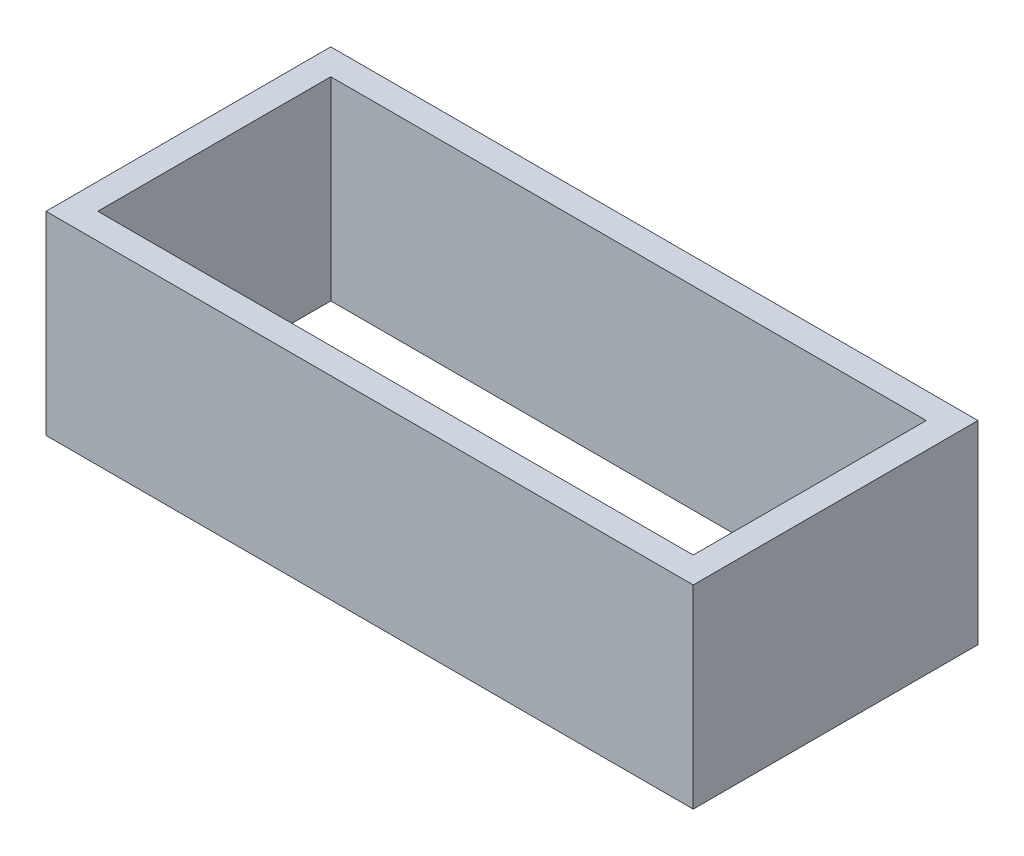
ISO-10303-21;
HEADER;
FILE_DESCRIPTION(('STEP AP214'),'2;1');
FILE_NAME('part.step','',(''),(''),'','','');
FILE_SCHEMA(('AUTOMOTIVE_DESIGN { 1 0 10303 214 1 1 1 1 }'));
ENDSEC;
DATA;
#1=APPLICATION_CONTEXT('core data for automotive mechanical design processes');
#2=APPLICATION_PROTOCOL_DEFINITION('international standard','automotive_design',2000,#1);
#3=PRODUCT_CONTEXT('',#1,'mechanical');
#4=PRODUCT('Part','Part','',(#3));
#5=PRODUCT_RELATED_PRODUCT_CATEGORY('part','',(#4));
#6=PRODUCT_DEFINITION_FORMATION('','',#4);
#7=PRODUCT_DEFINITION_CONTEXT('part definition',#1,'design');
#8=PRODUCT_DEFINITION('design','',#6,#7);
#9=PRODUCT_DEFINITION_SHAPE('','',#8);
#10=(LENGTH_UNIT() NAMED_UNIT(*) SI_UNIT(.MILLI.,.METRE.));
#11=(NAMED_UNIT(*) PLANE_ANGLE_UNIT() SI_UNIT($,.RADIAN.));
#12=(NAMED_UNIT(*) SI_UNIT($,.STERADIAN.) SOLID_ANGLE_UNIT());
#13=UNCERTAINTY_MEASURE_WITH_UNIT(LENGTH_MEASURE(1.E-05),#10,'distance_accuracy_value','');
#14=(GEOMETRIC_REPRESENTATION_CONTEXT(3) GLOBAL_UNCERTAINTY_ASSIGNED_CONTEXT((#13)) GLOBAL_UNIT_ASSIGNED_CONTEXT((#10,
#11,#12)) REPRESENTATION_CONTEXT('',''));
#15=CARTESIAN_POINT('',(0.,0.,0.));
#16=DIRECTION('',(0.,0.,1.));
#17=DIRECTION('',(1.,0.,0.));
#18=AXIS2_PLACEMENT_3D('',#15,#16,#17);
#19=CARTESIAN_POINT('',(0.,30.,0.));
#20=DIRECTION('',(0.,-1.,0.));
#21=DIRECTION('',(0.,0.,-1.));
#22=AXIS2_PLACEMENT_3D('',#19,#20,#21);
#23=PLANE('',#22);
#24=DIRECTION('',(0.,0.,-1.));
#25=VECTOR('',#24,1.);
#26=CARTESIAN_POINT('',(50.,30.,22.));
#27=LINE('',#26,#25);
#28=CARTESIAN_POINT('',(50.,30.,22.));
#29=VERTEX_POINT('',#28);
#30=CARTESIAN_POINT('',(50.,30.,-22.));
#31=VERTEX_POINT('',#30);
#32=EDGE_CURVE('E142',#29,#31,#27,.T.);
#33=ORIENTED_EDGE('',*,*,#32,.T.);
#34=DIRECTION('',(-1.,0.,0.));
#35=VECTOR('',#34,1.);
#36=CARTESIAN_POINT('',(-50.,30.,-22.));
#37=LINE('',#36,#35);
#38=CARTESIAN_POINT('',(-50.,30.,-22.));
#39=VERTEX_POINT('',#38);
#40=EDGE_CURVE('E145',#31,#39,#37,.T.);
#41=ORIENTED_EDGE('',*,*,#40,.T.);
#42=DIRECTION('',(0.,0.,1.));
#43=VECTOR('',#42,1.);
#44=CARTESIAN_POINT('',(-50.,30.,22.));
#45=LINE('',#44,#43);
#46=CARTESIAN_POINT('',(-50.,30.,22.));
#47=VERTEX_POINT('',#46);
#48=EDGE_CURVE('E148',#39,#47,#45,.T.);
#49=ORIENTED_EDGE('',*,*,#48,.T.);
#50=DIRECTION('',(1.,0.,0.));
#51=VECTOR('',#50,1.);
#52=CARTESIAN_POINT('',(-50.,30.,22.));
#53=LINE('',#52,#51);
#54=EDGE_CURVE('E150',#47,#29,#53,.T.);
#55=ORIENTED_EDGE('',*,*,#54,.T.);
#56=EDGE_LOOP('',(#33,#41,#49,#55));
#57=FACE_BOUND('',#56,.T.);
#58=DIRECTION('',(0.,0.,-1.));
#59=VECTOR('',#58,1.);
#60=CARTESIAN_POINT('',(46.,30.,-18.));
#61=LINE('',#60,#59);
#62=CARTESIAN_POINT('',(46.,30.,18.));
#63=VERTEX_POINT('',#62);
#64=CARTESIAN_POINT('',(46.,30.,-18.));
#65=VERTEX_POINT('',#64);
#66=EDGE_CURVE('E106',#63,#65,#61,.T.);
#67=ORIENTED_EDGE('',*,*,#66,.F.);
#68=DIRECTION('',(1.,0.,0.));
#69=VECTOR('',#68,1.);
#70=CARTESIAN_POINT('',(-46.,30.,18.));
#71=LINE('',#70,#69);
#72=CARTESIAN_POINT('',(-46.,30.,18.));
#73=VERTEX_POINT('',#72);
#74=EDGE_CURVE('E128',#73,#63,#71,.T.);
#75=ORIENTED_EDGE('',*,*,#74,.F.);
#76=DIRECTION('',(0.,0.,1.));
#77=VECTOR('',#76,1.);
#78=CARTESIAN_POINT('',(-46.,30.,-18.));
#79=LINE('',#78,#77);
#80=CARTESIAN_POINT('',(-46.,30.,-18.));
#81=VERTEX_POINT('',#80);
#82=EDGE_CURVE('E126',#81,#73,#79,.T.);
#83=ORIENTED_EDGE('',*,*,#82,.F.);
#84=DIRECTION('',(-1.,0.,0.));
#85=VECTOR('',#84,1.);
#86=CARTESIAN_POINT('',(-46.,30.,-18.));
#87=LINE('',#86,#85);
#88=EDGE_CURVE('E114',#65,#81,#87,.T.);
#89=ORIENTED_EDGE('',*,*,#88,.F.);
#90=EDGE_LOOP('',(#67,#75,#83,#89));
#91=FACE_BOUND('',#90,.T.);
#92=ADVANCED_FACE('F41',(#57,#91),#23,.F.);
#93=CARTESIAN_POINT('',(0.,0.,0.));
#94=DIRECTION('',(0.,-1.,0.));
#95=DIRECTION('',(0.,0.,-1.));
#96=AXIS2_PLACEMENT_3D('',#93,#94,#95);
#97=PLANE('',#96);
#98=DIRECTION('',(0.,0.,-1.));
#99=VECTOR('',#98,1.);
#100=CARTESIAN_POINT('',(50.,0.,22.));
#101=LINE('',#100,#99);
#102=CARTESIAN_POINT('',(50.,0.,22.));
#103=VERTEX_POINT('',#102);
#104=CARTESIAN_POINT('',(50.,0.,-22.));
#105=VERTEX_POINT('',#104);
#106=EDGE_CURVE('E122',#103,#105,#101,.T.);
#107=ORIENTED_EDGE('',*,*,#106,.F.);
#108=DIRECTION('',(1.,0.,0.));
#109=VECTOR('',#108,1.);
#110=CARTESIAN_POINT('',(-50.,0.,22.));
#111=LINE('',#110,#109);
#112=CARTESIAN_POINT('',(-50.,0.,22.));
#113=VERTEX_POINT('',#112);
#114=EDGE_CURVE('E146',#113,#103,#111,.T.);
#115=ORIENTED_EDGE('',*,*,#114,.F.);
#116=DIRECTION('',(0.,0.,1.));
#117=VECTOR('',#116,1.);
#118=CARTESIAN_POINT('',(-50.,0.,22.));
#119=LINE('',#118,#117);
#120=CARTESIAN_POINT('',(-50.,0.,-22.));
#121=VERTEX_POINT('',#120);
#122=EDGE_CURVE('E157',#121,#113,#119,.T.);
#123=ORIENTED_EDGE('',*,*,#122,.F.);
#124=DIRECTION('',(-1.,0.,0.));
#125=VECTOR('',#124,1.);
#126=CARTESIAN_POINT('',(-50.,0.,-22.));
#127=LINE('',#126,#125);
#128=EDGE_CURVE('E155',#105,#121,#127,.T.);
#129=ORIENTED_EDGE('',*,*,#128,.F.);
#130=EDGE_LOOP('',(#107,#115,#123,#129));
#131=FACE_BOUND('',#130,.T.);
#132=DIRECTION('',(1.,0.,0.));
#133=VECTOR('',#132,1.);
#134=CARTESIAN_POINT('',(-46.,0.,18.));
#135=LINE('',#134,#133);
#136=CARTESIAN_POINT('',(-46.,0.,18.));
#137=VERTEX_POINT('',#136);
#138=CARTESIAN_POINT('',(46.,0.,18.));
#139=VERTEX_POINT('',#138);
#140=EDGE_CURVE('E115',#137,#139,#135,.T.);
#141=ORIENTED_EDGE('',*,*,#140,.T.);
#142=DIRECTION('',(0.,0.,-1.));
#143=VECTOR('',#142,1.);
#144=CARTESIAN_POINT('',(46.,0.,-18.));
#145=LINE('',#144,#143);
#146=CARTESIAN_POINT('',(46.,0.,-18.));
#147=VERTEX_POINT('',#146);
#148=EDGE_CURVE('E64',#139,#147,#145,.T.);
#149=ORIENTED_EDGE('',*,*,#148,.T.);
#150=DIRECTION('',(-1.,0.,0.));
#151=VECTOR('',#150,1.);
#152=CARTESIAN_POINT('',(-46.,0.,-18.));
#153=LINE('',#152,#151);
#154=CARTESIAN_POINT('',(-46.,0.,-18.));
#155=VERTEX_POINT('',#154);
#156=EDGE_CURVE('E121',#147,#155,#153,.T.);
#157=ORIENTED_EDGE('',*,*,#156,.T.);
#158=DIRECTION('',(0.,0.,1.));
#159=VECTOR('',#158,1.);
#160=CARTESIAN_POINT('',(-46.,0.,-18.));
#161=LINE('',#160,#159);
#162=EDGE_CURVE('E134',#155,#137,#161,.T.);
#163=ORIENTED_EDGE('',*,*,#162,.T.);
#164=EDGE_LOOP('',(#141,#149,#157,#163));
#165=FACE_BOUND('',#164,.T.);
#166=ADVANCED_FACE('F175',(#131,#165),#97,.T.);
#167=CARTESIAN_POINT('',(50.,30.,22.));
#168=DIRECTION('',(-1.,0.,0.));
#169=DIRECTION('',(0.,0.,1.));
#170=AXIS2_PLACEMENT_3D('',#167,#168,#169);
#171=PLANE('',#170);
#172=ORIENTED_EDGE('',*,*,#106,.T.);
#173=DIRECTION('',(0.,-1.,0.));
#174=VECTOR('',#173,1.);
#175=CARTESIAN_POINT('',(50.,30.,-22.));
#176=LINE('',#175,#174);
#177=EDGE_CURVE('E11',#31,#105,#176,.T.);
#178=ORIENTED_EDGE('',*,*,#177,.F.);
#179=ORIENTED_EDGE('',*,*,#32,.F.);
#180=DIRECTION('',(0.,-1.,0.));
#181=VECTOR('',#180,1.);
#182=CARTESIAN_POINT('',(50.,30.,22.));
#183=LINE('',#182,#181);
#184=EDGE_CURVE('E152',#29,#103,#183,.T.);
#185=ORIENTED_EDGE('',*,*,#184,.T.);
#186=EDGE_LOOP('',(#172,#178,#179,#185));
#187=FACE_BOUND('',#186,.T.);
#188=ADVANCED_FACE('F43',(#187),#171,.F.);
#189=CARTESIAN_POINT('',(-50.,30.,-22.));
#190=DIRECTION('',(0.,0.,1.));
#191=DIRECTION('',(1.,0.,0.));
#192=AXIS2_PLACEMENT_3D('',#189,#190,#191);
#193=PLANE('',#192);
#194=ORIENTED_EDGE('',*,*,#128,.T.);
#195=DIRECTION('',(0.,-1.,0.));
#196=VECTOR('',#195,1.);
#197=CARTESIAN_POINT('',(-50.,30.,-22.));
#198=LINE('',#197,#196);
#199=EDGE_CURVE('E49',#39,#121,#198,.T.);
#200=ORIENTED_EDGE('',*,*,#199,.F.);
#201=ORIENTED_EDGE('',*,*,#40,.F.);
#202=ORIENTED_EDGE('',*,*,#177,.T.);
#203=EDGE_LOOP('',(#194,#200,#201,#202));
#204=FACE_BOUND('',#203,.T.);
#205=ADVANCED_FACE('F185',(#204),#193,.F.);
#206=CARTESIAN_POINT('',(-50.,30.,22.));
#207=DIRECTION('',(1.,0.,0.));
#208=DIRECTION('',(0.,0.,-1.));
#209=AXIS2_PLACEMENT_3D('',#206,#207,#208);
#210=PLANE('',#209);
#211=ORIENTED_EDGE('',*,*,#122,.T.);
#212=DIRECTION('',(0.,-1.,0.));
#213=VECTOR('',#212,1.);
#214=CARTESIAN_POINT('',(-50.,30.,22.));
#215=LINE('',#214,#213);
#216=EDGE_CURVE('E162',#47,#113,#215,.T.);
#217=ORIENTED_EDGE('',*,*,#216,.F.);
#218=ORIENTED_EDGE('',*,*,#48,.F.);
#219=ORIENTED_EDGE('',*,*,#199,.T.);
#220=EDGE_LOOP('',(#211,#217,#218,#219));
#221=FACE_BOUND('',#220,.T.);
#222=ADVANCED_FACE('F169',(#221),#210,.F.);
#223=CARTESIAN_POINT('',(-50.,30.,22.));
#224=DIRECTION('',(0.,0.,-1.));
#225=DIRECTION('',(-1.,0.,0.));
#226=AXIS2_PLACEMENT_3D('',#223,#224,#225);
#227=PLANE('',#226);
#228=ORIENTED_EDGE('',*,*,#114,.T.);
#229=ORIENTED_EDGE('',*,*,#184,.F.);
#230=ORIENTED_EDGE('',*,*,#54,.F.);
#231=ORIENTED_EDGE('',*,*,#216,.T.);
#232=EDGE_LOOP('',(#228,#229,#230,#231));
#233=FACE_BOUND('',#232,.T.);
#234=ADVANCED_FACE('F179',(#233),#227,.F.);
#235=CARTESIAN_POINT('',(46.,30.,-18.));
#236=DIRECTION('',(-1.,0.,0.));
#237=DIRECTION('',(0.,0.,1.));
#238=AXIS2_PLACEMENT_3D('',#235,#236,#237);
#239=PLANE('',#238);
#240=ORIENTED_EDGE('',*,*,#148,.F.);
#241=DIRECTION('',(0.,-1.,0.));
#242=VECTOR('',#241,1.);
#243=CARTESIAN_POINT('',(46.,30.,18.));
#244=LINE('',#243,#242);
#245=EDGE_CURVE('E110',#63,#139,#244,.T.);
#246=ORIENTED_EDGE('',*,*,#245,.F.);
#247=ORIENTED_EDGE('',*,*,#66,.T.);
#248=DIRECTION('',(0.,-1.,0.));
#249=VECTOR('',#248,1.);
#250=CARTESIAN_POINT('',(46.,30.,-18.));
#251=LINE('',#250,#249);
#252=EDGE_CURVE('E109',#65,#147,#251,.T.);
#253=ORIENTED_EDGE('',*,*,#252,.T.);
#254=EDGE_LOOP('',(#240,#246,#247,#253));
#255=FACE_BOUND('',#254,.T.);
#256=ADVANCED_FACE('F108',(#255),#239,.T.);
#257=CARTESIAN_POINT('',(-46.,30.,-18.));
#258=DIRECTION('',(0.,0.,1.));
#259=DIRECTION('',(1.,0.,0.));
#260=AXIS2_PLACEMENT_3D('',#257,#258,#259);
#261=PLANE('',#260);
#262=ORIENTED_EDGE('',*,*,#156,.F.);
#263=ORIENTED_EDGE('',*,*,#252,.F.);
#264=ORIENTED_EDGE('',*,*,#88,.T.);
#265=DIRECTION('',(0.,-1.,0.));
#266=VECTOR('',#265,1.);
#267=CARTESIAN_POINT('',(-46.,30.,-18.));
#268=LINE('',#267,#266);
#269=EDGE_CURVE('E123',#81,#155,#268,.T.);
#270=ORIENTED_EDGE('',*,*,#269,.T.);
#271=EDGE_LOOP('',(#262,#263,#264,#270));
#272=FACE_BOUND('',#271,.T.);
#273=ADVANCED_FACE('F118',(#272),#261,.T.);
#274=CARTESIAN_POINT('',(-46.,30.,-18.));
#275=DIRECTION('',(1.,0.,0.));
#276=DIRECTION('',(0.,0.,-1.));
#277=AXIS2_PLACEMENT_3D('',#274,#275,#276);
#278=PLANE('',#277);
#279=ORIENTED_EDGE('',*,*,#162,.F.);
#280=ORIENTED_EDGE('',*,*,#269,.F.);
#281=ORIENTED_EDGE('',*,*,#82,.T.);
#282=DIRECTION('',(0.,-1.,0.));
#283=VECTOR('',#282,1.);
#284=CARTESIAN_POINT('',(-46.,30.,18.));
#285=LINE('',#284,#283);
#286=EDGE_CURVE('E56',#73,#137,#285,.T.);
#287=ORIENTED_EDGE('',*,*,#286,.T.);
#288=EDGE_LOOP('',(#279,#280,#281,#287));
#289=FACE_BOUND('',#288,.T.);
#290=ADVANCED_FACE('F208',(#289),#278,.T.);
#291=CARTESIAN_POINT('',(-46.,30.,18.));
#292=DIRECTION('',(0.,0.,-1.));
#293=DIRECTION('',(-1.,0.,0.));
#294=AXIS2_PLACEMENT_3D('',#291,#292,#293);
#295=PLANE('',#294);
#296=ORIENTED_EDGE('',*,*,#140,.F.);
#297=ORIENTED_EDGE('',*,*,#286,.F.);
#298=ORIENTED_EDGE('',*,*,#74,.T.);
#299=ORIENTED_EDGE('',*,*,#245,.T.);
#300=EDGE_LOOP('',(#296,#297,#298,#299));
#301=FACE_BOUND('',#300,.T.);
#302=ADVANCED_FACE('F212',(#301),#295,.T.);
#303=CLOSED_SHELL('',(#92,#166,#188,#205,#222,#234,#256,#273,#290,#302));
#304=MANIFOLD_SOLID_BREP('B2',#303);
#305=ADVANCED_BREP_SHAPE_REPRESENTATION('',(#18,#304),#14);
#306=SHAPE_DEFINITION_REPRESENTATION(#9,#305);
ENDSEC;
END-ISO-10303-21;
